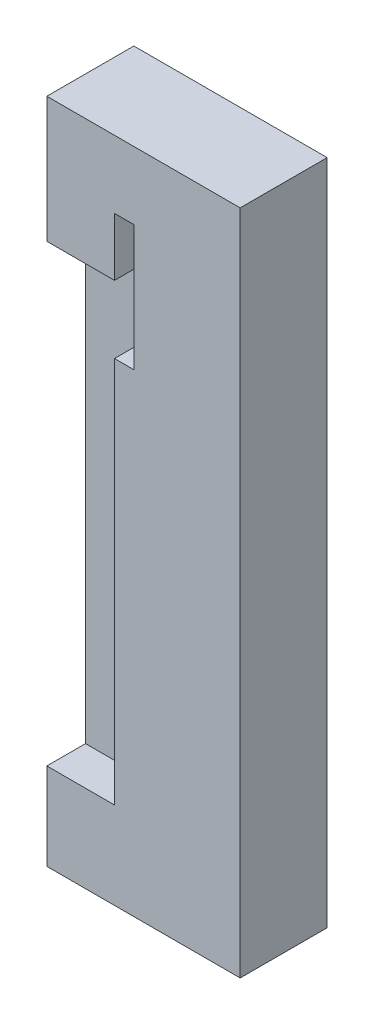
ISO-10303-21;
HEADER;
FILE_DESCRIPTION(('STEP AP214'),'2;1');
FILE_NAME('part.step','',(''),(''),'','','');
FILE_SCHEMA(('AUTOMOTIVE_DESIGN { 1 0 10303 214 1 1 1 1 }'));
ENDSEC;
DATA;
#1=APPLICATION_CONTEXT('core data for automotive mechanical design processes');
#2=APPLICATION_PROTOCOL_DEFINITION('international standard','automotive_design',2000,#1);
#3=PRODUCT_CONTEXT('',#1,'mechanical');
#4=PRODUCT('Part','Part','',(#3));
#5=PRODUCT_RELATED_PRODUCT_CATEGORY('part','',(#4));
#6=PRODUCT_DEFINITION_FORMATION('','',#4);
#7=PRODUCT_DEFINITION_CONTEXT('part definition',#1,'design');
#8=PRODUCT_DEFINITION('design','',#6,#7);
#9=PRODUCT_DEFINITION_SHAPE('','',#8);
#10=(LENGTH_UNIT() NAMED_UNIT(*) SI_UNIT(.MILLI.,.METRE.));
#11=(NAMED_UNIT(*) PLANE_ANGLE_UNIT() SI_UNIT($,.RADIAN.));
#12=(NAMED_UNIT(*) SI_UNIT($,.STERADIAN.) SOLID_ANGLE_UNIT());
#13=UNCERTAINTY_MEASURE_WITH_UNIT(LENGTH_MEASURE(1.E-05),#10,'distance_accuracy_value','');
#14=(GEOMETRIC_REPRESENTATION_CONTEXT(3) GLOBAL_UNCERTAINTY_ASSIGNED_CONTEXT((#13)) GLOBAL_UNIT_ASSIGNED_CONTEXT((#10,
#11,#12)) REPRESENTATION_CONTEXT('',''));
#15=CARTESIAN_POINT('',(0.,0.,0.));
#16=DIRECTION('',(0.,0.,1.));
#17=DIRECTION('',(1.,0.,0.));
#18=AXIS2_PLACEMENT_3D('',#15,#16,#17);
#19=CARTESIAN_POINT('',(-15.9031235431236,5.08846153846154,9.));
#20=DIRECTION('',(1.,0.,0.));
#21=DIRECTION('',(0.,1.,0.));
#22=AXIS2_PLACEMENT_3D('',#19,#20,#21);
#23=PLANE('',#22);
#24=DIRECTION('',(0.,-1.,0.));
#25=VECTOR('',#24,1.);
#26=CARTESIAN_POINT('',(-15.9031235431236,5.08846153846154,9.));
#27=LINE('',#26,#25);
#28=CARTESIAN_POINT('',(-15.9031235431236,-54.9115384615384,9.));
#29=VERTEX_POINT('',#28);
#30=CARTESIAN_POINT('',(-15.9031235431236,-63.9115384615385,9.));
#31=VERTEX_POINT('',#30);
#32=EDGE_CURVE('E77',#29,#31,#27,.T.);
#33=ORIENTED_EDGE('',*,*,#32,.F.);
#34=DIRECTION('',(0.,0.,1.));
#35=VECTOR('',#34,1.);
#36=CARTESIAN_POINT('',(-15.9031235431236,-54.9115384615384,5.));
#37=LINE('',#36,#35);
#38=CARTESIAN_POINT('',(-15.9031235431236,-54.9115384615384,5.));
#39=VERTEX_POINT('',#38);
#40=EDGE_CURVE('E199',#39,#29,#37,.T.);
#41=ORIENTED_EDGE('',*,*,#40,.F.);
#42=DIRECTION('',(0.,-1.,0.));
#43=VECTOR('',#42,1.);
#44=CARTESIAN_POINT('',(-15.9031235431236,-54.9115384615384,5.));
#45=LINE('',#44,#43);
#46=CARTESIAN_POINT('',(-15.9031235431236,-7.91153846153837,5.));
#47=VERTEX_POINT('',#46);
#48=EDGE_CURVE('E183',#47,#39,#45,.T.);
#49=ORIENTED_EDGE('',*,*,#48,.F.);
#50=DIRECTION('',(0.,0.,1.));
#51=VECTOR('',#50,1.);
#52=CARTESIAN_POINT('',(-15.9031235431236,-7.91153846153837,5.));
#53=LINE('',#52,#51);
#54=CARTESIAN_POINT('',(-15.9031235431236,-7.91153846153837,9.));
#55=VERTEX_POINT('',#54);
#56=EDGE_CURVE('E201',#47,#55,#53,.T.);
#57=ORIENTED_EDGE('',*,*,#56,.T.);
#58=CARTESIAN_POINT('',(-15.9031235431236,5.08846153846154,9.));
#59=VERTEX_POINT('',#58);
#60=EDGE_CURVE('E206',#59,#55,#27,.T.);
#61=ORIENTED_EDGE('',*,*,#60,.F.);
#62=DIRECTION('',(0.,0.,-1.));
#63=VECTOR('',#62,1.);
#64=CARTESIAN_POINT('',(-15.9031235431236,5.08846153846154,9.));
#65=LINE('',#64,#63);
#66=CARTESIAN_POINT('',(-15.9031235431236,5.08846153846154,0.));
#67=VERTEX_POINT('',#66);
#68=EDGE_CURVE('E213',#59,#67,#65,.T.);
#69=ORIENTED_EDGE('',*,*,#68,.T.);
#70=DIRECTION('',(0.,-1.,0.));
#71=VECTOR('',#70,1.);
#72=CARTESIAN_POINT('',(-15.9031235431236,5.08846153846154,0.));
#73=LINE('',#72,#71);
#74=CARTESIAN_POINT('',(-15.9031235431236,-63.9115384615385,0.));
#75=VERTEX_POINT('',#74);
#76=EDGE_CURVE('E198',#67,#75,#73,.T.);
#77=ORIENTED_EDGE('',*,*,#76,.T.);
#78=DIRECTION('',(0.,0.,-1.));
#79=VECTOR('',#78,1.);
#80=CARTESIAN_POINT('',(-15.9031235431236,-63.9115384615385,9.));
#81=LINE('',#80,#79);
#82=EDGE_CURVE('E11',#31,#75,#81,.T.);
#83=ORIENTED_EDGE('',*,*,#82,.F.);
#84=EDGE_LOOP('',(#33,#41,#49,#57,#61,#69,#77,#83));
#85=FACE_BOUND('',#84,.T.);
#86=ADVANCED_FACE('F30',(#85),#23,.F.);
#87=CARTESIAN_POINT('',(-15.9031235431236,-63.9115384615385,9.));
#88=DIRECTION('',(0.,1.,0.));
#89=DIRECTION('',(0.,0.,1.));
#90=AXIS2_PLACEMENT_3D('',#87,#88,#89);
#91=PLANE('',#90);
#92=DIRECTION('',(1.,0.,0.));
#93=VECTOR('',#92,1.);
#94=CARTESIAN_POINT('',(-15.9031235431236,-63.9115384615385,0.));
#95=LINE('',#94,#93);
#96=CARTESIAN_POINT('',(4.09687645687644,-63.9115384615385,0.));
#97=VERTEX_POINT('',#96);
#98=EDGE_CURVE('E216',#75,#97,#95,.T.);
#99=ORIENTED_EDGE('',*,*,#98,.T.);
#100=DIRECTION('',(0.,0.,-1.));
#101=VECTOR('',#100,1.);
#102=CARTESIAN_POINT('',(4.09687645687644,-63.9115384615385,9.));
#103=LINE('',#102,#101);
#104=CARTESIAN_POINT('',(4.09687645687644,-63.9115384615385,9.));
#105=VERTEX_POINT('',#104);
#106=EDGE_CURVE('E38',#105,#97,#103,.T.);
#107=ORIENTED_EDGE('',*,*,#106,.F.);
#108=DIRECTION('',(1.,0.,0.));
#109=VECTOR('',#108,1.);
#110=CARTESIAN_POINT('',(-15.9031235431236,-63.9115384615385,9.));
#111=LINE('',#110,#109);
#112=EDGE_CURVE('E208',#31,#105,#111,.T.);
#113=ORIENTED_EDGE('',*,*,#112,.F.);
#114=ORIENTED_EDGE('',*,*,#82,.T.);
#115=EDGE_LOOP('',(#99,#107,#113,#114));
#116=FACE_BOUND('',#115,.T.);
#117=ADVANCED_FACE('F242',(#116),#91,.F.);
#118=CARTESIAN_POINT('',(4.09687645687643,5.08846153846154,9.));
#119=DIRECTION('',(-1.,0.,0.));
#120=DIRECTION('',(0.,-1.,0.));
#121=AXIS2_PLACEMENT_3D('',#118,#119,#120);
#122=PLANE('',#121);
#123=DIRECTION('',(0.,1.,0.));
#124=VECTOR('',#123,1.);
#125=CARTESIAN_POINT('',(4.09687645687643,5.08846153846154,0.));
#126=LINE('',#125,#124);
#127=CARTESIAN_POINT('',(4.09687645687643,5.08846153846154,0.));
#128=VERTEX_POINT('',#127);
#129=EDGE_CURVE('E64',#97,#128,#126,.T.);
#130=ORIENTED_EDGE('',*,*,#129,.T.);
#131=DIRECTION('',(0.,0.,-1.));
#132=VECTOR('',#131,1.);
#133=CARTESIAN_POINT('',(4.09687645687643,5.08846153846154,9.));
#134=LINE('',#133,#132);
#135=CARTESIAN_POINT('',(4.09687645687643,5.08846153846154,9.));
#136=VERTEX_POINT('',#135);
#137=EDGE_CURVE('E221',#136,#128,#134,.T.);
#138=ORIENTED_EDGE('',*,*,#137,.F.);
#139=DIRECTION('',(0.,1.,0.));
#140=VECTOR('',#139,1.);
#141=CARTESIAN_POINT('',(4.09687645687643,5.08846153846154,9.));
#142=LINE('',#141,#140);
#143=EDGE_CURVE('E210',#105,#136,#142,.T.);
#144=ORIENTED_EDGE('',*,*,#143,.F.);
#145=ORIENTED_EDGE('',*,*,#106,.T.);
#146=EDGE_LOOP('',(#130,#138,#144,#145));
#147=FACE_BOUND('',#146,.T.);
#148=ADVANCED_FACE('F224',(#147),#122,.F.);
#149=CARTESIAN_POINT('',(-15.9031235431236,5.08846153846154,9.));
#150=DIRECTION('',(0.,-1.,0.));
#151=DIRECTION('',(0.,0.,-1.));
#152=AXIS2_PLACEMENT_3D('',#149,#150,#151);
#153=PLANE('',#152);
#154=DIRECTION('',(-1.,0.,0.));
#155=VECTOR('',#154,1.);
#156=CARTESIAN_POINT('',(-15.9031235431236,5.08846153846154,0.));
#157=LINE('',#156,#155);
#158=EDGE_CURVE('E70',#128,#67,#157,.T.);
#159=ORIENTED_EDGE('',*,*,#158,.T.);
#160=ORIENTED_EDGE('',*,*,#68,.F.);
#161=DIRECTION('',(-1.,0.,0.));
#162=VECTOR('',#161,1.);
#163=CARTESIAN_POINT('',(-15.9031235431236,5.08846153846154,9.));
#164=LINE('',#163,#162);
#165=EDGE_CURVE('E46',#136,#59,#164,.T.);
#166=ORIENTED_EDGE('',*,*,#165,.F.);
#167=ORIENTED_EDGE('',*,*,#137,.T.);
#168=EDGE_LOOP('',(#159,#160,#166,#167));
#169=FACE_BOUND('',#168,.T.);
#170=ADVANCED_FACE('F232',(#169),#153,.F.);
#171=CARTESIAN_POINT('',(-15.9031235431236,-63.9115384615385,9.));
#172=DIRECTION('',(0.,0.,1.));
#173=DIRECTION('',(1.,0.,0.));
#174=AXIS2_PLACEMENT_3D('',#171,#172,#173);
#175=PLANE('',#174);
#176=DIRECTION('',(0.,-1.,0.));
#177=VECTOR('',#176,1.);
#178=CARTESIAN_POINT('',(-8.90312354312369,-1.91153846153847,9.));
#179=LINE('',#178,#177);
#180=CARTESIAN_POINT('',(-8.90312354312369,-1.91153846153847,9.));
#181=VERTEX_POINT('',#180);
#182=CARTESIAN_POINT('',(-8.90312354312369,-7.91153846153837,9.));
#183=VERTEX_POINT('',#182);
#184=EDGE_CURVE('E165',#181,#183,#179,.T.);
#185=ORIENTED_EDGE('',*,*,#184,.F.);
#186=DIRECTION('',(-1.,0.,0.));
#187=VECTOR('',#186,1.);
#188=CARTESIAN_POINT('',(-8.90312354312369,-1.91153846153847,9.));
#189=LINE('',#188,#187);
#190=CARTESIAN_POINT('',(-6.90312354312368,-1.91153846153847,9.));
#191=VERTEX_POINT('',#190);
#192=EDGE_CURVE('E157',#191,#181,#189,.T.);
#193=ORIENTED_EDGE('',*,*,#192,.F.);
#194=DIRECTION('',(0.,1.,0.));
#195=VECTOR('',#194,1.);
#196=CARTESIAN_POINT('',(-6.90312354312368,-1.91153846153847,9.));
#197=LINE('',#196,#195);
#198=CARTESIAN_POINT('',(-6.90312354312368,-14.9115384615385,9.));
#199=VERTEX_POINT('',#198);
#200=EDGE_CURVE('E160',#199,#191,#197,.T.);
#201=ORIENTED_EDGE('',*,*,#200,.F.);
#202=DIRECTION('',(1.,0.,0.));
#203=VECTOR('',#202,1.);
#204=CARTESIAN_POINT('',(-8.90312354312369,-14.9115384615385,9.));
#205=LINE('',#204,#203);
#206=CARTESIAN_POINT('',(-8.90312354312369,-14.9115384615385,9.));
#207=VERTEX_POINT('',#206);
#208=EDGE_CURVE('E167',#207,#199,#205,.T.);
#209=ORIENTED_EDGE('',*,*,#208,.F.);
#210=DIRECTION('',(0.,1.,0.));
#211=VECTOR('',#210,1.);
#212=CARTESIAN_POINT('',(-8.90312354312368,-54.9115384615384,9.));
#213=LINE('',#212,#211);
#214=CARTESIAN_POINT('',(-8.90312354312368,-54.9115384615384,9.));
#215=VERTEX_POINT('',#214);
#216=EDGE_CURVE('E173',#215,#207,#213,.T.);
#217=ORIENTED_EDGE('',*,*,#216,.F.);
#218=DIRECTION('',(1.,0.,0.));
#219=VECTOR('',#218,1.);
#220=CARTESIAN_POINT('',(-8.90312354312368,-54.9115384615384,9.));
#221=LINE('',#220,#219);
#222=EDGE_CURVE('E193',#29,#215,#221,.T.);
#223=ORIENTED_EDGE('',*,*,#222,.F.);
#224=ORIENTED_EDGE('',*,*,#32,.T.);
#225=ORIENTED_EDGE('',*,*,#112,.T.);
#226=ORIENTED_EDGE('',*,*,#143,.T.);
#227=ORIENTED_EDGE('',*,*,#165,.T.);
#228=ORIENTED_EDGE('',*,*,#60,.T.);
#229=DIRECTION('',(-1.,0.,0.));
#230=VECTOR('',#229,1.);
#231=CARTESIAN_POINT('',(-8.90312354312368,-7.91153846153837,9.));
#232=LINE('',#231,#230);
#233=EDGE_CURVE('E191',#183,#55,#232,.T.);
#234=ORIENTED_EDGE('',*,*,#233,.F.);
#235=EDGE_LOOP('',(#185,#193,#201,#209,#217,#223,#224,#225,#226,#227,#228,#234));
#236=FACE_BOUND('',#235,.T.);
#237=ADVANCED_FACE('F234',(#236),#175,.T.);
#238=CARTESIAN_POINT('',(-15.9031235431236,-63.9115384615385,0.));
#239=DIRECTION('',(0.,0.,1.));
#240=DIRECTION('',(1.,0.,0.));
#241=AXIS2_PLACEMENT_3D('',#238,#239,#240);
#242=PLANE('',#241);
#243=ORIENTED_EDGE('',*,*,#76,.F.);
#244=ORIENTED_EDGE('',*,*,#158,.F.);
#245=ORIENTED_EDGE('',*,*,#129,.F.);
#246=ORIENTED_EDGE('',*,*,#98,.F.);
#247=EDGE_LOOP('',(#243,#244,#245,#246));
#248=FACE_BOUND('',#247,.T.);
#249=ADVANCED_FACE('F228',(#248),#242,.F.);
#250=CARTESIAN_POINT('',(-8.90312354312368,-54.9115384615384,5.));
#251=DIRECTION('',(1.,0.,0.));
#252=DIRECTION('',(0.,0.,-1.));
#253=AXIS2_PLACEMENT_3D('',#250,#251,#252);
#254=PLANE('',#253);
#255=ORIENTED_EDGE('',*,*,#216,.T.);
#256=DIRECTION('',(0.,0.,1.));
#257=VECTOR('',#256,1.);
#258=CARTESIAN_POINT('',(-8.90312354312369,-14.9115384615385,4.));
#259=LINE('',#258,#257);
#260=CARTESIAN_POINT('',(-8.90312354312369,-14.9115384615385,5.));
#261=VERTEX_POINT('',#260);
#262=EDGE_CURVE('E143',#261,#207,#259,.T.);
#263=ORIENTED_EDGE('',*,*,#262,.F.);
#264=DIRECTION('',(0.,1.,0.));
#265=VECTOR('',#264,1.);
#266=CARTESIAN_POINT('',(-8.90312354312368,-54.9115384615384,5.));
#267=LINE('',#266,#265);
#268=CARTESIAN_POINT('',(-8.90312354312368,-54.9115384615384,5.));
#269=VERTEX_POINT('',#268);
#270=EDGE_CURVE('E177',#269,#261,#267,.T.);
#271=ORIENTED_EDGE('',*,*,#270,.F.);
#272=DIRECTION('',(0.,0.,1.));
#273=VECTOR('',#272,1.);
#274=CARTESIAN_POINT('',(-8.90312354312368,-54.9115384615384,5.));
#275=LINE('',#274,#273);
#276=EDGE_CURVE('E196',#269,#215,#275,.T.);
#277=ORIENTED_EDGE('',*,*,#276,.T.);
#278=EDGE_LOOP('',(#255,#263,#271,#277));
#279=FACE_BOUND('',#278,.T.);
#280=ADVANCED_FACE('F268',(#279),#254,.F.);
#281=CARTESIAN_POINT('',(-8.90312354312368,-54.9115384615384,5.));
#282=DIRECTION('',(0.,-1.,0.));
#283=DIRECTION('',(0.,0.,-1.));
#284=AXIS2_PLACEMENT_3D('',#281,#282,#283);
#285=PLANE('',#284);
#286=ORIENTED_EDGE('',*,*,#222,.T.);
#287=ORIENTED_EDGE('',*,*,#276,.F.);
#288=DIRECTION('',(1.,0.,0.));
#289=VECTOR('',#288,1.);
#290=CARTESIAN_POINT('',(-8.90312354312368,-54.9115384615384,5.));
#291=LINE('',#290,#289);
#292=EDGE_CURVE('E185',#39,#269,#291,.T.);
#293=ORIENTED_EDGE('',*,*,#292,.F.);
#294=ORIENTED_EDGE('',*,*,#40,.T.);
#295=EDGE_LOOP('',(#286,#287,#293,#294));
#296=FACE_BOUND('',#295,.T.);
#297=ADVANCED_FACE('F264',(#296),#285,.F.);
#298=CARTESIAN_POINT('',(-8.90312354312368,-7.91153846153837,5.));
#299=DIRECTION('',(0.,1.,0.));
#300=DIRECTION('',(0.,0.,1.));
#301=AXIS2_PLACEMENT_3D('',#298,#299,#300);
#302=PLANE('',#301);
#303=ORIENTED_EDGE('',*,*,#233,.T.);
#304=ORIENTED_EDGE('',*,*,#56,.F.);
#305=DIRECTION('',(-1.,0.,0.));
#306=VECTOR('',#305,1.);
#307=CARTESIAN_POINT('',(-8.90312354312368,-7.91153846153837,5.));
#308=LINE('',#307,#306);
#309=CARTESIAN_POINT('',(-8.90312354312368,-7.91153846153837,5.));
#310=VERTEX_POINT('',#309);
#311=EDGE_CURVE('E180',#310,#47,#308,.T.);
#312=ORIENTED_EDGE('',*,*,#311,.F.);
#313=DIRECTION('',(0.,0.,1.));
#314=VECTOR('',#313,1.);
#315=CARTESIAN_POINT('',(-8.90312354312368,-7.91153846153837,5.));
#316=LINE('',#315,#314);
#317=EDGE_CURVE('E188',#310,#183,#316,.T.);
#318=ORIENTED_EDGE('',*,*,#317,.T.);
#319=EDGE_LOOP('',(#303,#304,#312,#318));
#320=FACE_BOUND('',#319,.T.);
#321=ADVANCED_FACE('F257',(#320),#302,.F.);
#322=CARTESIAN_POINT('',(-8.90312354312368,-7.91153846153837,5.));
#323=DIRECTION('',(0.,0.,1.));
#324=DIRECTION('',(1.,0.,0.));
#325=AXIS2_PLACEMENT_3D('',#322,#323,#324);
#326=PLANE('',#325);
#327=ORIENTED_EDGE('',*,*,#270,.T.);
#328=EDGE_CURVE('E139',#261,#310,#267,.T.);
#329=ORIENTED_EDGE('',*,*,#328,.T.);
#330=ORIENTED_EDGE('',*,*,#311,.T.);
#331=ORIENTED_EDGE('',*,*,#48,.T.);
#332=ORIENTED_EDGE('',*,*,#292,.T.);
#333=EDGE_LOOP('',(#327,#329,#330,#331,#332));
#334=FACE_BOUND('',#333,.T.);
#335=ADVANCED_FACE('F260',(#334),#326,.T.);
#336=CARTESIAN_POINT('',(-8.90312354312369,-1.91153846153847,4.));
#337=DIRECTION('',(-1.,0.,0.));
#338=DIRECTION('',(0.,0.,1.));
#339=AXIS2_PLACEMENT_3D('',#336,#337,#338);
#340=PLANE('',#339);
#341=ORIENTED_EDGE('',*,*,#328,.F.);
#342=CARTESIAN_POINT('',(-8.90312354312369,-14.9115384615385,4.));
#343=VERTEX_POINT('',#342);
#344=EDGE_CURVE('E132',#343,#261,#259,.T.);
#345=ORIENTED_EDGE('',*,*,#344,.F.);
#346=DIRECTION('',(0.,-1.,0.));
#347=VECTOR('',#346,1.);
#348=CARTESIAN_POINT('',(-8.90312354312369,-1.91153846153847,4.));
#349=LINE('',#348,#347);
#350=CARTESIAN_POINT('',(-8.90312354312369,-1.91153846153847,4.));
#351=VERTEX_POINT('',#350);
#352=EDGE_CURVE('E136',#351,#343,#349,.T.);
#353=ORIENTED_EDGE('',*,*,#352,.F.);
#354=DIRECTION('',(0.,0.,1.));
#355=VECTOR('',#354,1.);
#356=CARTESIAN_POINT('',(-8.90312354312369,-1.91153846153847,4.));
#357=LINE('',#356,#355);
#358=EDGE_CURVE('E171',#351,#181,#357,.T.);
#359=ORIENTED_EDGE('',*,*,#358,.T.);
#360=ORIENTED_EDGE('',*,*,#184,.T.);
#361=ORIENTED_EDGE('',*,*,#317,.F.);
#362=EDGE_LOOP('',(#341,#345,#353,#359,#360,#361));
#363=FACE_BOUND('',#362,.T.);
#364=ADVANCED_FACE('F134',(#363),#340,.F.);
#365=CARTESIAN_POINT('',(-8.90312354312369,-1.91153846153847,4.));
#366=DIRECTION('',(0.,1.,0.));
#367=DIRECTION('',(0.,0.,1.));
#368=AXIS2_PLACEMENT_3D('',#365,#366,#367);
#369=PLANE('',#368);
#370=ORIENTED_EDGE('',*,*,#192,.T.);
#371=ORIENTED_EDGE('',*,*,#358,.F.);
#372=DIRECTION('',(-1.,0.,0.));
#373=VECTOR('',#372,1.);
#374=CARTESIAN_POINT('',(-8.90312354312369,-1.91153846153847,4.));
#375=LINE('',#374,#373);
#376=CARTESIAN_POINT('',(-6.90312354312368,-1.91153846153847,4.));
#377=VERTEX_POINT('',#376);
#378=EDGE_CURVE('E156',#377,#351,#375,.T.);
#379=ORIENTED_EDGE('',*,*,#378,.F.);
#380=DIRECTION('',(0.,0.,1.));
#381=VECTOR('',#380,1.);
#382=CARTESIAN_POINT('',(-6.90312354312368,-1.91153846153847,4.));
#383=LINE('',#382,#381);
#384=EDGE_CURVE('E174',#377,#191,#383,.T.);
#385=ORIENTED_EDGE('',*,*,#384,.T.);
#386=EDGE_LOOP('',(#370,#371,#379,#385));
#387=FACE_BOUND('',#386,.T.);
#388=ADVANCED_FACE('F273',(#387),#369,.F.);
#389=CARTESIAN_POINT('',(-6.90312354312368,-1.91153846153847,4.));
#390=DIRECTION('',(1.,0.,0.));
#391=DIRECTION('',(0.,0.,-1.));
#392=AXIS2_PLACEMENT_3D('',#389,#390,#391);
#393=PLANE('',#392);
#394=ORIENTED_EDGE('',*,*,#200,.T.);
#395=ORIENTED_EDGE('',*,*,#384,.F.);
#396=DIRECTION('',(0.,1.,0.));
#397=VECTOR('',#396,1.);
#398=CARTESIAN_POINT('',(-6.90312354312368,-1.91153846153847,4.));
#399=LINE('',#398,#397);
#400=CARTESIAN_POINT('',(-6.90312354312368,-14.9115384615385,4.));
#401=VERTEX_POINT('',#400);
#402=EDGE_CURVE('E152',#401,#377,#399,.T.);
#403=ORIENTED_EDGE('',*,*,#402,.F.);
#404=DIRECTION('',(0.,0.,1.));
#405=VECTOR('',#404,1.);
#406=CARTESIAN_POINT('',(-6.90312354312368,-14.9115384615385,4.));
#407=LINE('',#406,#405);
#408=EDGE_CURVE('E142',#401,#199,#407,.T.);
#409=ORIENTED_EDGE('',*,*,#408,.T.);
#410=EDGE_LOOP('',(#394,#395,#403,#409));
#411=FACE_BOUND('',#410,.T.);
#412=ADVANCED_FACE('F271',(#411),#393,.F.);
#413=CARTESIAN_POINT('',(-8.90312354312369,-14.9115384615385,4.));
#414=DIRECTION('',(0.,-1.,0.));
#415=DIRECTION('',(0.,0.,-1.));
#416=AXIS2_PLACEMENT_3D('',#413,#414,#415);
#417=PLANE('',#416);
#418=ORIENTED_EDGE('',*,*,#208,.T.);
#419=ORIENTED_EDGE('',*,*,#408,.F.);
#420=DIRECTION('',(1.,0.,0.));
#421=VECTOR('',#420,1.);
#422=CARTESIAN_POINT('',(-8.90312354312369,-14.9115384615385,4.));
#423=LINE('',#422,#421);
#424=EDGE_CURVE('E146',#343,#401,#423,.T.);
#425=ORIENTED_EDGE('',*,*,#424,.F.);
#426=ORIENTED_EDGE('',*,*,#344,.T.);
#427=ORIENTED_EDGE('',*,*,#262,.T.);
#428=EDGE_LOOP('',(#418,#419,#425,#426,#427));
#429=FACE_BOUND('',#428,.T.);
#430=ADVANCED_FACE('F148',(#429),#417,.F.);
#431=CARTESIAN_POINT('',(-8.90312354312369,-14.9115384615385,4.));
#432=DIRECTION('',(0.,0.,1.));
#433=DIRECTION('',(1.,0.,0.));
#434=AXIS2_PLACEMENT_3D('',#431,#432,#433);
#435=PLANE('',#434);
#436=ORIENTED_EDGE('',*,*,#352,.T.);
#437=ORIENTED_EDGE('',*,*,#424,.T.);
#438=ORIENTED_EDGE('',*,*,#402,.T.);
#439=ORIENTED_EDGE('',*,*,#378,.T.);
#440=EDGE_LOOP('',(#436,#437,#438,#439));
#441=FACE_BOUND('',#440,.T.);
#442=ADVANCED_FACE('F154',(#441),#435,.T.);
#443=CLOSED_SHELL('',(#86,#117,#148,#170,#237,#249,#280,#297,#321,#335,#364,#388,#412,#430,#442));
#444=MANIFOLD_SOLID_BREP('B2',#443);
#445=ADVANCED_BREP_SHAPE_REPRESENTATION('',(#18,#444),#14);
#446=SHAPE_DEFINITION_REPRESENTATION(#9,#445);
ENDSEC;
END-ISO-10303-21;
